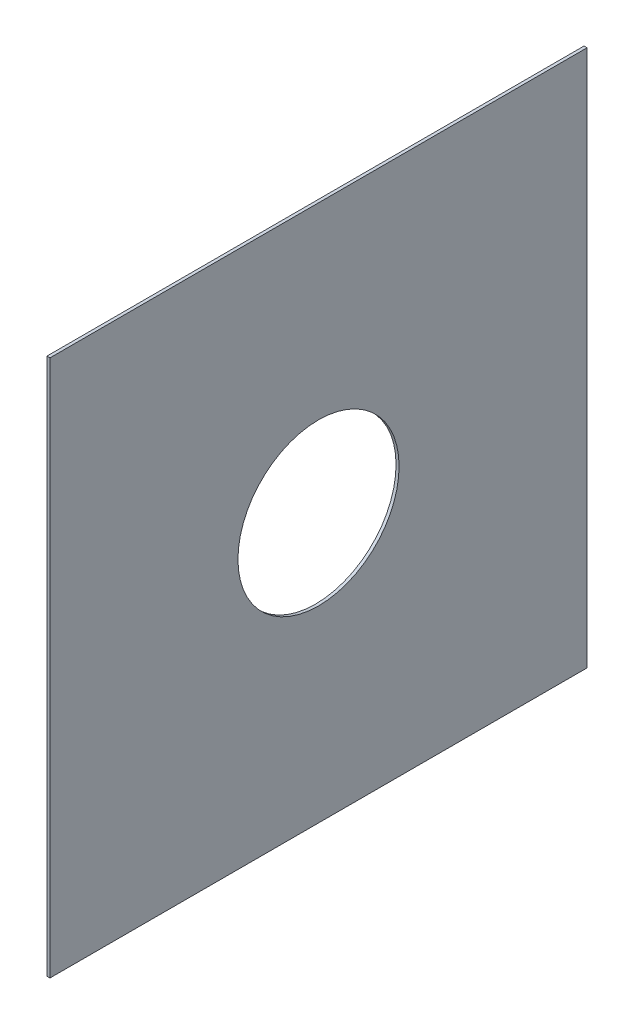
ISO-10303-21;
HEADER;
FILE_DESCRIPTION(('STEP AP214'),'2;1');
FILE_NAME('part.step','',(''),(''),'','','');
FILE_SCHEMA(('AUTOMOTIVE_DESIGN { 1 0 10303 214 1 1 1 1 }'));
ENDSEC;
DATA;
#1=APPLICATION_CONTEXT('core data for automotive mechanical design processes');
#2=APPLICATION_PROTOCOL_DEFINITION('international standard','automotive_design',2000,#1);
#3=PRODUCT_CONTEXT('',#1,'mechanical');
#4=PRODUCT('Part','Part','',(#3));
#5=PRODUCT_RELATED_PRODUCT_CATEGORY('part','',(#4));
#6=PRODUCT_DEFINITION_FORMATION('','',#4);
#7=PRODUCT_DEFINITION_CONTEXT('part definition',#1,'design');
#8=PRODUCT_DEFINITION('design','',#6,#7);
#9=PRODUCT_DEFINITION_SHAPE('','',#8);
#10=(LENGTH_UNIT() NAMED_UNIT(*) SI_UNIT(.MILLI.,.METRE.));
#11=(NAMED_UNIT(*) PLANE_ANGLE_UNIT() SI_UNIT($,.RADIAN.));
#12=(NAMED_UNIT(*) SI_UNIT($,.STERADIAN.) SOLID_ANGLE_UNIT());
#13=UNCERTAINTY_MEASURE_WITH_UNIT(LENGTH_MEASURE(1.E-05),#10,'distance_accuracy_value','');
#14=(GEOMETRIC_REPRESENTATION_CONTEXT(3) GLOBAL_UNCERTAINTY_ASSIGNED_CONTEXT((#13)) GLOBAL_UNIT_ASSIGNED_CONTEXT((#10,
#11,#12)) REPRESENTATION_CONTEXT('',''));
#15=CARTESIAN_POINT('',(0.,0.,0.));
#16=DIRECTION('',(0.,0.,1.));
#17=DIRECTION('',(1.,0.,0.));
#18=AXIS2_PLACEMENT_3D('',#15,#16,#17);
#19=CARTESIAN_POINT('',(3.,265.,265.));
#20=DIRECTION('',(0.,-1.,0.));
#21=DIRECTION('',(0.,0.,-1.));
#22=AXIS2_PLACEMENT_3D('',#19,#20,#21);
#23=PLANE('',#22);
#24=DIRECTION('',(0.,0.,1.));
#25=VECTOR('',#24,1.);
#26=CARTESIAN_POINT('',(0.,265.,265.));
#27=LINE('',#26,#25);
#28=CARTESIAN_POINT('',(0.,265.,-265.));
#29=VERTEX_POINT('',#28);
#30=CARTESIAN_POINT('',(0.,265.,265.));
#31=VERTEX_POINT('',#30);
#32=EDGE_CURVE('E97',#29,#31,#27,.T.);
#33=ORIENTED_EDGE('',*,*,#32,.T.);
#34=DIRECTION('',(-1.,0.,0.));
#35=VECTOR('',#34,1.);
#36=CARTESIAN_POINT('',(3.,265.,265.));
#37=LINE('',#36,#35);
#38=CARTESIAN_POINT('',(3.,265.,265.));
#39=VERTEX_POINT('',#38);
#40=EDGE_CURVE('E11',#39,#31,#37,.T.);
#41=ORIENTED_EDGE('',*,*,#40,.F.);
#42=DIRECTION('',(0.,0.,1.));
#43=VECTOR('',#42,1.);
#44=CARTESIAN_POINT('',(3.,265.,265.));
#45=LINE('',#44,#43);
#46=CARTESIAN_POINT('',(3.,265.,-265.));
#47=VERTEX_POINT('',#46);
#48=EDGE_CURVE('E85',#47,#39,#45,.T.);
#49=ORIENTED_EDGE('',*,*,#48,.F.);
#50=DIRECTION('',(-1.,0.,0.));
#51=VECTOR('',#50,1.);
#52=CARTESIAN_POINT('',(3.,265.,-265.));
#53=LINE('',#52,#51);
#54=EDGE_CURVE('E93',#47,#29,#53,.T.);
#55=ORIENTED_EDGE('',*,*,#54,.T.);
#56=EDGE_LOOP('',(#33,#41,#49,#55));
#57=FACE_BOUND('',#56,.T.);
#58=ADVANCED_FACE('F34',(#57),#23,.F.);
#59=CARTESIAN_POINT('',(3.,-265.,265.));
#60=DIRECTION('',(0.,0.,-1.));
#61=DIRECTION('',(0.,1.,0.));
#62=AXIS2_PLACEMENT_3D('',#59,#60,#61);
#63=PLANE('',#62);
#64=DIRECTION('',(0.,-1.,0.));
#65=VECTOR('',#64,1.);
#66=CARTESIAN_POINT('',(0.,-265.,265.));
#67=LINE('',#66,#65);
#68=CARTESIAN_POINT('',(0.,-265.,265.));
#69=VERTEX_POINT('',#68);
#70=EDGE_CURVE('E89',#31,#69,#67,.T.);
#71=ORIENTED_EDGE('',*,*,#70,.T.);
#72=DIRECTION('',(-1.,0.,0.));
#73=VECTOR('',#72,1.);
#74=CARTESIAN_POINT('',(3.,-265.,265.));
#75=LINE('',#74,#73);
#76=CARTESIAN_POINT('',(3.,-265.,265.));
#77=VERTEX_POINT('',#76);
#78=EDGE_CURVE('E42',#77,#69,#75,.T.);
#79=ORIENTED_EDGE('',*,*,#78,.F.);
#80=DIRECTION('',(0.,-1.,0.));
#81=VECTOR('',#80,1.);
#82=CARTESIAN_POINT('',(3.,-265.,265.));
#83=LINE('',#82,#81);
#84=EDGE_CURVE('E80',#39,#77,#83,.T.);
#85=ORIENTED_EDGE('',*,*,#84,.F.);
#86=ORIENTED_EDGE('',*,*,#40,.T.);
#87=EDGE_LOOP('',(#71,#79,#85,#86));
#88=FACE_BOUND('',#87,.T.);
#89=ADVANCED_FACE('F88',(#88),#63,.F.);
#90=CARTESIAN_POINT('',(3.,-265.,265.));
#91=DIRECTION('',(0.,1.,0.));
#92=DIRECTION('',(0.,0.,1.));
#93=AXIS2_PLACEMENT_3D('',#90,#91,#92);
#94=PLANE('',#93);
#95=DIRECTION('',(0.,0.,-1.));
#96=VECTOR('',#95,1.);
#97=CARTESIAN_POINT('',(0.,-265.,265.));
#98=LINE('',#97,#96);
#99=CARTESIAN_POINT('',(0.,-265.,-265.));
#100=VERTEX_POINT('',#99);
#101=EDGE_CURVE('E67',#69,#100,#98,.T.);
#102=ORIENTED_EDGE('',*,*,#101,.T.);
#103=DIRECTION('',(-1.,0.,0.));
#104=VECTOR('',#103,1.);
#105=CARTESIAN_POINT('',(3.,-265.,-265.));
#106=LINE('',#105,#104);
#107=CARTESIAN_POINT('',(3.,-265.,-265.));
#108=VERTEX_POINT('',#107);
#109=EDGE_CURVE('E90',#108,#100,#106,.T.);
#110=ORIENTED_EDGE('',*,*,#109,.F.);
#111=DIRECTION('',(0.,0.,-1.));
#112=VECTOR('',#111,1.);
#113=CARTESIAN_POINT('',(3.,-265.,265.));
#114=LINE('',#113,#112);
#115=EDGE_CURVE('E83',#77,#108,#114,.T.);
#116=ORIENTED_EDGE('',*,*,#115,.F.);
#117=ORIENTED_EDGE('',*,*,#78,.T.);
#118=EDGE_LOOP('',(#102,#110,#116,#117));
#119=FACE_BOUND('',#118,.T.);
#120=ADVANCED_FACE('F91',(#119),#94,.F.);
#121=CARTESIAN_POINT('',(3.,-265.,-265.));
#122=DIRECTION('',(0.,0.,1.));
#123=DIRECTION('',(0.,-1.,0.));
#124=AXIS2_PLACEMENT_3D('',#121,#122,#123);
#125=PLANE('',#124);
#126=DIRECTION('',(0.,1.,0.));
#127=VECTOR('',#126,1.);
#128=CARTESIAN_POINT('',(0.,-265.,-265.));
#129=LINE('',#128,#127);
#130=EDGE_CURVE('E73',#100,#29,#129,.T.);
#131=ORIENTED_EDGE('',*,*,#130,.T.);
#132=ORIENTED_EDGE('',*,*,#54,.F.);
#133=DIRECTION('',(0.,1.,0.));
#134=VECTOR('',#133,1.);
#135=CARTESIAN_POINT('',(3.,-265.,-265.));
#136=LINE('',#135,#134);
#137=EDGE_CURVE('E50',#108,#47,#136,.T.);
#138=ORIENTED_EDGE('',*,*,#137,.F.);
#139=ORIENTED_EDGE('',*,*,#109,.T.);
#140=EDGE_LOOP('',(#131,#132,#138,#139));
#141=FACE_BOUND('',#140,.T.);
#142=ADVANCED_FACE('F105',(#141),#125,.F.);
#143=CARTESIAN_POINT('',(3.,265.,-265.));
#144=DIRECTION('',(1.,0.,0.));
#145=DIRECTION('',(0.,0.,-1.));
#146=AXIS2_PLACEMENT_3D('',#143,#144,#145);
#147=PLANE('',#146);
#148=CARTESIAN_POINT('',(3.,0.,0.));
#149=DIRECTION('',(-1.,0.,0.));
#150=DIRECTION('',(0.,0.,1.));
#151=AXIS2_PLACEMENT_3D('',#148,#149,#150);
#152=CIRCLE('',#151,79.5);
#153=CARTESIAN_POINT('',(3.,0.,79.5));
#154=VERTEX_POINT('',#153);
#155=EDGE_CURVE('E100',#154,#154,#152,.T.);
#156=ORIENTED_EDGE('',*,*,#155,.T.);
#157=EDGE_LOOP('',(#156));
#158=FACE_BOUND('',#157,.T.);
#159=ORIENTED_EDGE('',*,*,#48,.T.);
#160=ORIENTED_EDGE('',*,*,#84,.T.);
#161=ORIENTED_EDGE('',*,*,#115,.T.);
#162=ORIENTED_EDGE('',*,*,#137,.T.);
#163=EDGE_LOOP('',(#159,#160,#161,#162));
#164=FACE_BOUND('',#163,.T.);
#165=ADVANCED_FACE('F81',(#158,#164),#147,.T.);
#166=CARTESIAN_POINT('',(0.,265.,-265.));
#167=DIRECTION('',(1.,0.,0.));
#168=DIRECTION('',(0.,0.,-1.));
#169=AXIS2_PLACEMENT_3D('',#166,#167,#168);
#170=PLANE('',#169);
#171=CARTESIAN_POINT('',(0.,0.,0.));
#172=DIRECTION('',(-1.,0.,0.));
#173=DIRECTION('',(0.,0.,1.));
#174=AXIS2_PLACEMENT_3D('',#171,#172,#173);
#175=CIRCLE('',#174,79.5);
#176=CARTESIAN_POINT('',(0.,0.,79.5));
#177=VERTEX_POINT('',#176);
#178=EDGE_CURVE('E111',#177,#177,#175,.T.);
#179=ORIENTED_EDGE('',*,*,#178,.F.);
#180=EDGE_LOOP('',(#179));
#181=FACE_BOUND('',#180,.T.);
#182=ORIENTED_EDGE('',*,*,#32,.F.);
#183=ORIENTED_EDGE('',*,*,#130,.F.);
#184=ORIENTED_EDGE('',*,*,#101,.F.);
#185=ORIENTED_EDGE('',*,*,#70,.F.);
#186=EDGE_LOOP('',(#182,#183,#184,#185));
#187=FACE_BOUND('',#186,.T.);
#188=ADVANCED_FACE('F108',(#181,#187),#170,.F.);
#189=CARTESIAN_POINT('',(3.,0.,0.));
#190=DIRECTION('',(-1.,0.,0.));
#191=DIRECTION('',(0.,0.,1.));
#192=AXIS2_PLACEMENT_3D('',#189,#190,#191);
#193=CYLINDRICAL_SURFACE('',#192,79.5);
#194=ORIENTED_EDGE('',*,*,#155,.F.);
#195=EDGE_LOOP('',(#194));
#196=FACE_BOUND('',#195,.T.);
#197=ORIENTED_EDGE('',*,*,#178,.T.);
#198=EDGE_LOOP('',(#197));
#199=FACE_BOUND('',#198,.T.);
#200=ADVANCED_FACE('F118',(#196,#199),#193,.F.);
#201=CLOSED_SHELL('',(#58,#89,#120,#142,#165,#188,#200));
#202=MANIFOLD_SOLID_BREP('B2',#201);
#203=ADVANCED_BREP_SHAPE_REPRESENTATION('',(#18,#202),#14);
#204=SHAPE_DEFINITION_REPRESENTATION(#9,#203);
ENDSEC;
END-ISO-10303-21;
